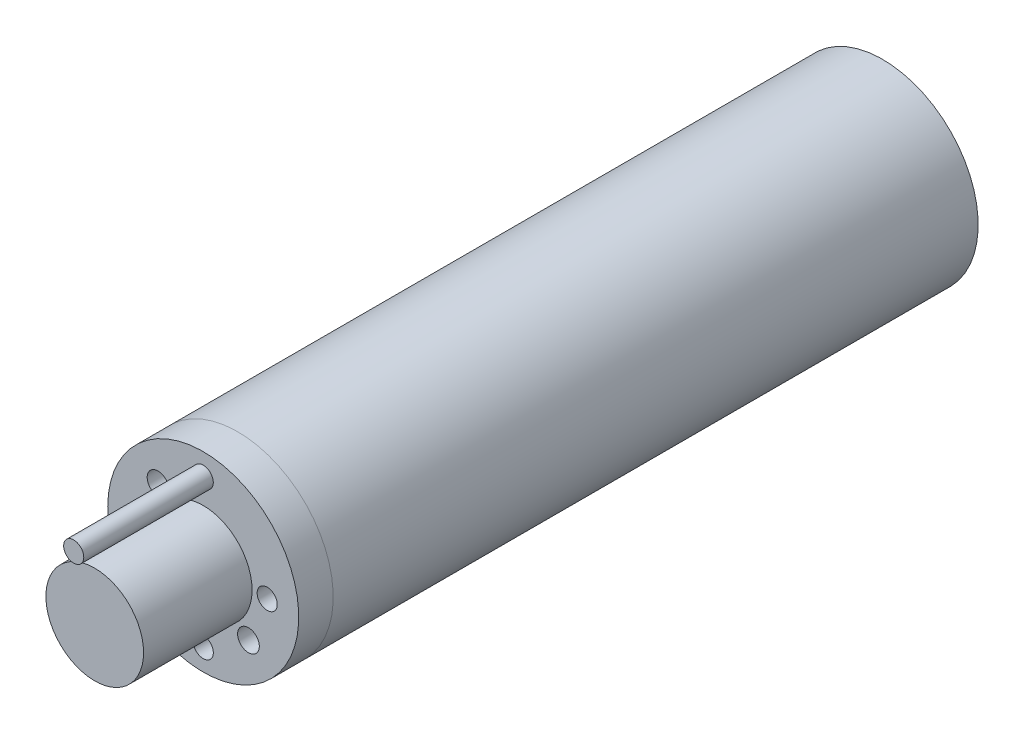
ISO-10303-21;
HEADER;
FILE_DESCRIPTION(('STEP AP214'),'2;1');
FILE_NAME('part.step','',(''),(''),'','','');
FILE_SCHEMA(('AUTOMOTIVE_DESIGN { 1 0 10303 214 1 1 1 1 }'));
ENDSEC;
DATA;
#1=APPLICATION_CONTEXT('core data for automotive mechanical design processes');
#2=APPLICATION_PROTOCOL_DEFINITION('international standard','automotive_design',2000,#1);
#3=PRODUCT_CONTEXT('',#1,'mechanical');
#4=PRODUCT('Part','Part','',(#3));
#5=PRODUCT_RELATED_PRODUCT_CATEGORY('part','',(#4));
#6=PRODUCT_DEFINITION_FORMATION('','',#4);
#7=PRODUCT_DEFINITION_CONTEXT('part definition',#1,'design');
#8=PRODUCT_DEFINITION('design','',#6,#7);
#9=PRODUCT_DEFINITION_SHAPE('','',#8);
#10=(LENGTH_UNIT() NAMED_UNIT(*) SI_UNIT(.MILLI.,.METRE.));
#11=(NAMED_UNIT(*) PLANE_ANGLE_UNIT() SI_UNIT($,.RADIAN.));
#12=(NAMED_UNIT(*) SI_UNIT($,.STERADIAN.) SOLID_ANGLE_UNIT());
#13=UNCERTAINTY_MEASURE_WITH_UNIT(LENGTH_MEASURE(1.E-05),#10,'distance_accuracy_value','');
#14=(GEOMETRIC_REPRESENTATION_CONTEXT(3) GLOBAL_UNCERTAINTY_ASSIGNED_CONTEXT((#13)) GLOBAL_UNIT_ASSIGNED_CONTEXT((#10,
#11,#12)) REPRESENTATION_CONTEXT('',''));
#15=CARTESIAN_POINT('',(0.,0.,0.));
#16=DIRECTION('',(0.,0.,1.));
#17=DIRECTION('',(1.,0.,0.));
#18=AXIS2_PLACEMENT_3D('',#15,#16,#17);
#19=CARTESIAN_POINT('',(0.,0.,3.175));
#20=DIRECTION('',(0.,0.,1.));
#21=DIRECTION('',(-1.,0.,0.));
#22=AXIS2_PLACEMENT_3D('',#19,#20,#21);
#23=CYLINDRICAL_SURFACE('',#22,4.5);
#24=CARTESIAN_POINT('',(0.,0.,13.175));
#25=DIRECTION('',(0.,0.,1.));
#26=DIRECTION('',(-1.,0.,0.));
#27=AXIS2_PLACEMENT_3D('',#24,#25,#26);
#28=CIRCLE('',#27,4.5);
#29=CARTESIAN_POINT('',(4.5,0.,13.175));
#30=VERTEX_POINT('',#29);
#31=EDGE_CURVE('P0_E28',#30,#30,#28,.T.);
#32=ORIENTED_EDGE('',*,*,#31,.F.);
#33=DIRECTION('',(0.,0.,-1.));
#34=VECTOR('',#33,1.);
#35=CARTESIAN_POINT('',(4.5,0.,3.175));
#36=LINE('',#35,#34);
#37=CARTESIAN_POINT('',(4.5,0.,3.175));
#38=VERTEX_POINT('',#37);
#39=EDGE_CURVE('P0_E11',#30,#38,#36,.T.);
#40=ORIENTED_EDGE('',*,*,#39,.T.);
#41=CARTESIAN_POINT('',(0.,0.,3.175));
#42=DIRECTION('',(0.,0.,-1.));
#43=DIRECTION('',(-1.,0.,0.));
#44=AXIS2_PLACEMENT_3D('',#41,#42,#43);
#45=CIRCLE('',#44,4.5);
#46=EDGE_CURVE('P0_E112',#38,#38,#45,.T.);
#47=ORIENTED_EDGE('',*,*,#46,.F.);
#48=ORIENTED_EDGE('',*,*,#39,.F.);
#49=EDGE_LOOP('',(#32,#40,#47,#48));
#50=FACE_BOUND('',#49,.T.);
#51=ADVANCED_FACE('P0_F17',(#50),#23,.T.);
#52=CARTESIAN_POINT('',(0.,0.,13.175));
#53=DIRECTION('',(0.,0.,1.));
#54=DIRECTION('',(1.,0.,0.));
#55=AXIS2_PLACEMENT_3D('',#52,#53,#54);
#56=PLANE('',#55);
#57=ORIENTED_EDGE('',*,*,#31,.T.);
#58=EDGE_LOOP('',(#57));
#59=FACE_BOUND('',#58,.T.);
#60=ADVANCED_FACE('P0_F223',(#59),#56,.T.);
#61=CARTESIAN_POINT('',(4.16683884017609,-4.16683884017609,0.));
#62=DIRECTION('',(0.,0.,1.));
#63=DIRECTION('',(1.,0.,0.));
#64=AXIS2_PLACEMENT_3D('',#61,#62,#63);
#65=CYLINDRICAL_SURFACE('',#64,1.);
#66=CARTESIAN_POINT('',(4.16683884017609,-4.16683884017609,3.175));
#67=DIRECTION('',(0.,0.,-1.));
#68=DIRECTION('',(1.,0.,0.));
#69=AXIS2_PLACEMENT_3D('',#66,#67,#68);
#70=CIRCLE('',#69,1.);
#71=CARTESIAN_POINT('',(3.16683884017609,-4.16683884017609,3.175));
#72=VERTEX_POINT('',#71);
#73=EDGE_CURVE('P0_E193',#72,#72,#70,.T.);
#74=ORIENTED_EDGE('',*,*,#73,.F.);
#75=DIRECTION('',(0.,0.,-1.));
#76=VECTOR('',#75,1.);
#77=CARTESIAN_POINT('',(3.16683884017609,-4.16683884017609,0.));
#78=LINE('',#77,#76);
#79=CARTESIAN_POINT('',(3.16683884017609,-4.16683884017609,0.));
#80=VERTEX_POINT('',#79);
#81=EDGE_CURVE('P0_E156',#72,#80,#78,.T.);
#82=ORIENTED_EDGE('',*,*,#81,.T.);
#83=CARTESIAN_POINT('',(4.16683884017609,-4.16683884017609,0.));
#84=DIRECTION('',(0.,0.,-1.));
#85=DIRECTION('',(1.,0.,0.));
#86=AXIS2_PLACEMENT_3D('',#83,#84,#85);
#87=CIRCLE('',#86,1.);
#88=EDGE_CURVE('P0_E21',#80,#80,#87,.T.);
#89=ORIENTED_EDGE('',*,*,#88,.T.);
#90=ORIENTED_EDGE('',*,*,#81,.F.);
#91=EDGE_LOOP('',(#74,#82,#89,#90));
#92=FACE_BOUND('',#91,.T.);
#93=ADVANCED_FACE('P0_F19',(#92),#65,.F.);
#94=CARTESIAN_POINT('',(-4.16683884017609,4.16683884017609,0.));
#95=DIRECTION('',(0.,0.,1.));
#96=DIRECTION('',(1.,0.,0.));
#97=AXIS2_PLACEMENT_3D('',#94,#95,#96);
#98=CYLINDRICAL_SURFACE('',#97,1.);
#99=CARTESIAN_POINT('',(-4.16683884017609,4.16683884017609,3.175));
#100=DIRECTION('',(0.,0.,-1.));
#101=DIRECTION('',(1.,0.,0.));
#102=AXIS2_PLACEMENT_3D('',#99,#100,#101);
#103=CIRCLE('',#102,1.);
#104=CARTESIAN_POINT('',(-5.16683884017609,4.16683884017609,3.175));
#105=VERTEX_POINT('',#104);
#106=EDGE_CURVE('P0_E195',#105,#105,#103,.T.);
#107=ORIENTED_EDGE('',*,*,#106,.F.);
#108=DIRECTION('',(0.,0.,-1.));
#109=VECTOR('',#108,1.);
#110=CARTESIAN_POINT('',(-5.16683884017609,4.16683884017609,0.));
#111=LINE('',#110,#109);
#112=CARTESIAN_POINT('',(-5.16683884017609,4.16683884017609,0.));
#113=VERTEX_POINT('',#112);
#114=EDGE_CURVE('P0_E134',#105,#113,#111,.T.);
#115=ORIENTED_EDGE('',*,*,#114,.T.);
#116=CARTESIAN_POINT('',(-4.16683884017609,4.16683884017609,0.));
#117=DIRECTION('',(0.,0.,-1.));
#118=DIRECTION('',(1.,0.,0.));
#119=AXIS2_PLACEMENT_3D('',#116,#117,#118);
#120=CIRCLE('',#119,1.);
#121=EDGE_CURVE('P0_E65',#113,#113,#120,.T.);
#122=ORIENTED_EDGE('',*,*,#121,.T.);
#123=ORIENTED_EDGE('',*,*,#114,.F.);
#124=EDGE_LOOP('',(#107,#115,#122,#123));
#125=FACE_BOUND('',#124,.T.);
#126=ADVANCED_FACE('P0_F213',(#125),#98,.F.);
#127=CARTESIAN_POINT('',(5.8928,0.,0.));
#128=DIRECTION('',(0.,0.,1.));
#129=DIRECTION('',(1.,0.,0.));
#130=AXIS2_PLACEMENT_3D('',#127,#128,#129);
#131=CYLINDRICAL_SURFACE('',#130,0.927);
#132=CARTESIAN_POINT('',(5.8928,0.,3.175));
#133=DIRECTION('',(0.,0.,-1.));
#134=DIRECTION('',(1.,0.,0.));
#135=AXIS2_PLACEMENT_3D('',#132,#133,#134);
#136=CIRCLE('',#135,0.927);
#137=CARTESIAN_POINT('',(4.9658,0.,3.175));
#138=VERTEX_POINT('',#137);
#139=EDGE_CURVE('P0_E78',#138,#138,#136,.T.);
#140=ORIENTED_EDGE('',*,*,#139,.F.);
#141=DIRECTION('',(0.,0.,-1.));
#142=VECTOR('',#141,1.);
#143=CARTESIAN_POINT('',(4.9658,0.,0.));
#144=LINE('',#143,#142);
#145=CARTESIAN_POINT('',(4.9658,0.,0.));
#146=VERTEX_POINT('',#145);
#147=EDGE_CURVE('P0_E139',#138,#146,#144,.T.);
#148=ORIENTED_EDGE('',*,*,#147,.T.);
#149=CARTESIAN_POINT('',(5.8928,0.,0.));
#150=DIRECTION('',(0.,0.,-1.));
#151=DIRECTION('',(1.,0.,0.));
#152=AXIS2_PLACEMENT_3D('',#149,#150,#151);
#153=CIRCLE('',#152,0.927);
#154=EDGE_CURVE('P0_E88',#146,#146,#153,.T.);
#155=ORIENTED_EDGE('',*,*,#154,.T.);
#156=ORIENTED_EDGE('',*,*,#147,.F.);
#157=EDGE_LOOP('',(#140,#148,#155,#156));
#158=FACE_BOUND('',#157,.T.);
#159=ADVANCED_FACE('P0_F215',(#158),#131,.F.);
#160=CARTESIAN_POINT('',(-5.8928,0.,0.));
#161=DIRECTION('',(0.,0.,1.));
#162=DIRECTION('',(1.,0.,0.));
#163=AXIS2_PLACEMENT_3D('',#160,#161,#162);
#164=CYLINDRICAL_SURFACE('',#163,0.927);
#165=CARTESIAN_POINT('',(-5.8928,0.,3.175));
#166=DIRECTION('',(0.,0.,-1.));
#167=DIRECTION('',(1.,0.,0.));
#168=AXIS2_PLACEMENT_3D('',#165,#166,#167);
#169=CIRCLE('',#168,0.927);
#170=CARTESIAN_POINT('',(-6.8198,0.,3.175));
#171=VERTEX_POINT('',#170);
#172=EDGE_CURVE('P0_E155',#171,#171,#169,.T.);
#173=ORIENTED_EDGE('',*,*,#172,.F.);
#174=DIRECTION('',(0.,0.,-1.));
#175=VECTOR('',#174,1.);
#176=CARTESIAN_POINT('',(-6.8198,0.,0.));
#177=LINE('',#176,#175);
#178=CARTESIAN_POINT('',(-6.8198,0.,0.));
#179=VERTEX_POINT('',#178);
#180=EDGE_CURVE('P0_E151',#171,#179,#177,.T.);
#181=ORIENTED_EDGE('',*,*,#180,.T.);
#182=CARTESIAN_POINT('',(-5.8928,0.,0.));
#183=DIRECTION('',(0.,0.,-1.));
#184=DIRECTION('',(1.,0.,0.));
#185=AXIS2_PLACEMENT_3D('',#182,#183,#184);
#186=CIRCLE('',#185,0.927);
#187=EDGE_CURVE('P0_E147',#179,#179,#186,.T.);
#188=ORIENTED_EDGE('',*,*,#187,.T.);
#189=ORIENTED_EDGE('',*,*,#180,.F.);
#190=EDGE_LOOP('',(#173,#181,#188,#189));
#191=FACE_BOUND('',#190,.T.);
#192=ADVANCED_FACE('P0_F186',(#191),#164,.F.);
#193=CARTESIAN_POINT('',(0.,-6.7945,0.));
#194=DIRECTION('',(0.,0.,1.));
#195=DIRECTION('',(1.,0.,0.));
#196=AXIS2_PLACEMENT_3D('',#193,#194,#195);
#197=CYLINDRICAL_SURFACE('',#196,0.927);
#198=CARTESIAN_POINT('',(0.,-6.7945,3.175));
#199=DIRECTION('',(0.,0.,-1.));
#200=DIRECTION('',(1.,0.,0.));
#201=AXIS2_PLACEMENT_3D('',#198,#199,#200);
#202=CIRCLE('',#201,0.927);
#203=CARTESIAN_POINT('',(-0.927,-6.7945,3.175));
#204=VERTEX_POINT('',#203);
#205=EDGE_CURVE('P0_E143',#204,#204,#202,.T.);
#206=ORIENTED_EDGE('',*,*,#205,.F.);
#207=DIRECTION('',(0.,0.,-1.));
#208=VECTOR('',#207,1.);
#209=CARTESIAN_POINT('',(-0.927,-6.7945,0.));
#210=LINE('',#209,#208);
#211=CARTESIAN_POINT('',(-0.927,-6.7945,0.));
#212=VERTEX_POINT('',#211);
#213=EDGE_CURVE('P0_E125',#204,#212,#210,.T.);
#214=ORIENTED_EDGE('',*,*,#213,.T.);
#215=CARTESIAN_POINT('',(0.,-6.7945,0.));
#216=DIRECTION('',(0.,0.,-1.));
#217=DIRECTION('',(1.,0.,0.));
#218=AXIS2_PLACEMENT_3D('',#215,#216,#217);
#219=CIRCLE('',#218,0.927);
#220=EDGE_CURVE('P0_E132',#212,#212,#219,.T.);
#221=ORIENTED_EDGE('',*,*,#220,.T.);
#222=ORIENTED_EDGE('',*,*,#213,.F.);
#223=EDGE_LOOP('',(#206,#214,#221,#222));
#224=FACE_BOUND('',#223,.T.);
#225=ADVANCED_FACE('P0_F170',(#224),#197,.F.);
#226=CARTESIAN_POINT('',(0.,6.7945,0.));
#227=DIRECTION('',(0.,0.,1.));
#228=DIRECTION('',(1.,0.,0.));
#229=AXIS2_PLACEMENT_3D('',#226,#227,#228);
#230=CYLINDRICAL_SURFACE('',#229,0.927);
#231=CARTESIAN_POINT('',(0.,6.7945,3.175));
#232=DIRECTION('',(0.,0.,-1.));
#233=DIRECTION('',(1.,0.,0.));
#234=AXIS2_PLACEMENT_3D('',#231,#232,#233);
#235=CIRCLE('',#234,0.927);
#236=CARTESIAN_POINT('',(-0.927,6.7945,3.175));
#237=VERTEX_POINT('',#236);
#238=EDGE_CURVE('P0_E121',#237,#237,#235,.T.);
#239=ORIENTED_EDGE('',*,*,#238,.F.);
#240=DIRECTION('',(0.,0.,-1.));
#241=VECTOR('',#240,1.);
#242=CARTESIAN_POINT('',(-0.927,6.7945,0.));
#243=LINE('',#242,#241);
#244=CARTESIAN_POINT('',(-0.927,6.7945,0.));
#245=VERTEX_POINT('',#244);
#246=EDGE_CURVE('P0_E129',#237,#245,#243,.T.);
#247=ORIENTED_EDGE('',*,*,#246,.T.);
#248=CARTESIAN_POINT('',(0.,6.7945,0.));
#249=DIRECTION('',(0.,0.,-1.));
#250=DIRECTION('',(1.,0.,0.));
#251=AXIS2_PLACEMENT_3D('',#248,#249,#250);
#252=CIRCLE('',#251,0.927);
#253=EDGE_CURVE('P0_E127',#245,#245,#252,.T.);
#254=ORIENTED_EDGE('',*,*,#253,.T.);
#255=ORIENTED_EDGE('',*,*,#246,.F.);
#256=EDGE_LOOP('',(#239,#247,#254,#255));
#257=FACE_BOUND('',#256,.T.);
#258=ADVANCED_FACE('P0_F235',(#257),#230,.F.);
#259=CARTESIAN_POINT('',(0.,0.,0.));
#260=DIRECTION('',(0.,0.,1.));
#261=DIRECTION('',(1.,0.,0.));
#262=AXIS2_PLACEMENT_3D('',#259,#260,#261);
#263=CYLINDRICAL_SURFACE('',#262,8.8011);
#264=CARTESIAN_POINT('',(0.,0.,3.175));
#265=DIRECTION('',(0.,0.,1.));
#266=DIRECTION('',(1.,0.,0.));
#267=AXIS2_PLACEMENT_3D('',#264,#265,#266);
#268=CIRCLE('',#267,8.8011);
#269=CARTESIAN_POINT('',(-8.8011,0.,3.175));
#270=VERTEX_POINT('',#269);
#271=EDGE_CURVE('P0_E105',#270,#270,#268,.T.);
#272=ORIENTED_EDGE('',*,*,#271,.F.);
#273=DIRECTION('',(0.,0.,-1.));
#274=VECTOR('',#273,1.);
#275=CARTESIAN_POINT('',(-8.8011,0.,0.));
#276=LINE('',#275,#274);
#277=CARTESIAN_POINT('',(-8.8011,0.,0.));
#278=VERTEX_POINT('',#277);
#279=EDGE_CURVE('P0_E108',#270,#278,#276,.T.);
#280=ORIENTED_EDGE('',*,*,#279,.T.);
#281=CARTESIAN_POINT('',(0.,0.,0.));
#282=DIRECTION('',(0.,0.,1.));
#283=DIRECTION('',(1.,0.,0.));
#284=AXIS2_PLACEMENT_3D('',#281,#282,#283);
#285=CIRCLE('',#284,8.8011);
#286=EDGE_CURVE('P0_E111',#278,#278,#285,.T.);
#287=ORIENTED_EDGE('',*,*,#286,.T.);
#288=ORIENTED_EDGE('',*,*,#279,.F.);
#289=EDGE_LOOP('',(#272,#280,#287,#288));
#290=FACE_BOUND('',#289,.T.);
#291=ADVANCED_FACE('P0_F106',(#290),#263,.T.);
#292=CARTESIAN_POINT('',(0.,0.,3.175));
#293=DIRECTION('',(0.,0.,1.));
#294=DIRECTION('',(1.,0.,0.));
#295=AXIS2_PLACEMENT_3D('',#292,#293,#294);
#296=PLANE('',#295);
#297=ORIENTED_EDGE('',*,*,#271,.T.);
#298=EDGE_LOOP('',(#297));
#299=FACE_BOUND('',#298,.T.);
#300=ORIENTED_EDGE('',*,*,#46,.T.);
#301=EDGE_LOOP('',(#300));
#302=FACE_BOUND('',#301,.T.);
#303=ORIENTED_EDGE('',*,*,#238,.T.);
#304=EDGE_LOOP('',(#303));
#305=FACE_BOUND('',#304,.T.);
#306=ORIENTED_EDGE('',*,*,#205,.T.);
#307=EDGE_LOOP('',(#306));
#308=FACE_BOUND('',#307,.T.);
#309=ORIENTED_EDGE('',*,*,#172,.T.);
#310=EDGE_LOOP('',(#309));
#311=FACE_BOUND('',#310,.T.);
#312=ORIENTED_EDGE('',*,*,#139,.T.);
#313=EDGE_LOOP('',(#312));
#314=FACE_BOUND('',#313,.T.);
#315=ORIENTED_EDGE('',*,*,#106,.T.);
#316=EDGE_LOOP('',(#315));
#317=FACE_BOUND('',#316,.T.);
#318=ORIENTED_EDGE('',*,*,#73,.T.);
#319=EDGE_LOOP('',(#318));
#320=FACE_BOUND('',#319,.T.);
#321=ADVANCED_FACE('P0_F210',(#299,#302,#305,#308,#311,#314,#317,#320),#296,.T.);
#322=CARTESIAN_POINT('',(0.,0.,0.));
#323=DIRECTION('',(0.,0.,1.));
#324=DIRECTION('',(1.,0.,0.));
#325=AXIS2_PLACEMENT_3D('',#322,#323,#324);
#326=PLANE('',#325);
#327=ORIENTED_EDGE('',*,*,#286,.F.);
#328=EDGE_LOOP('',(#327));
#329=FACE_BOUND('',#328,.T.);
#330=ORIENTED_EDGE('',*,*,#253,.F.);
#331=EDGE_LOOP('',(#330));
#332=FACE_BOUND('',#331,.T.);
#333=ORIENTED_EDGE('',*,*,#220,.F.);
#334=EDGE_LOOP('',(#333));
#335=FACE_BOUND('',#334,.T.);
#336=ORIENTED_EDGE('',*,*,#187,.F.);
#337=EDGE_LOOP('',(#336));
#338=FACE_BOUND('',#337,.T.);
#339=ORIENTED_EDGE('',*,*,#154,.F.);
#340=EDGE_LOOP('',(#339));
#341=FACE_BOUND('',#340,.T.);
#342=ORIENTED_EDGE('',*,*,#121,.F.);
#343=EDGE_LOOP('',(#342));
#344=FACE_BOUND('',#343,.T.);
#345=ORIENTED_EDGE('',*,*,#88,.F.);
#346=EDGE_LOOP('',(#345));
#347=FACE_BOUND('',#346,.T.);
#348=ADVANCED_FACE('P0_F183',(#329,#332,#335,#338,#341,#344,#347),#326,.F.);
#349=CLOSED_SHELL('',(#51,#60,#93,#126,#159,#192,#225,#258,#291,#321,#348));
#350=MANIFOLD_SOLID_BREP('P0_B1',#349);
#351=CARTESIAN_POINT('',(0.,6.7945,3.175));
#352=DIRECTION('',(0.,0.,1.));
#353=DIRECTION('',(-1.,0.,0.));
#354=AXIS2_PLACEMENT_3D('',#351,#352,#353);
#355=CYLINDRICAL_SURFACE('',#354,0.927);
#356=CARTESIAN_POINT('',(0.,6.7945,15.113));
#357=DIRECTION('',(0.,0.,1.));
#358=DIRECTION('',(-1.,0.,0.));
#359=AXIS2_PLACEMENT_3D('',#356,#357,#358);
#360=CIRCLE('',#359,0.927);
#361=CARTESIAN_POINT('',(0.927,6.7945,15.113));
#362=VERTEX_POINT('',#361);
#363=EDGE_CURVE('P1_E37',#362,#362,#360,.T.);
#364=ORIENTED_EDGE('',*,*,#363,.F.);
#365=DIRECTION('',(0.,0.,-1.));
#366=VECTOR('',#365,1.);
#367=CARTESIAN_POINT('',(0.927,6.7945,3.175));
#368=LINE('',#367,#366);
#369=CARTESIAN_POINT('',(0.927,6.7945,3.175));
#370=VERTEX_POINT('',#369);
#371=EDGE_CURVE('P1_E11',#362,#370,#368,.T.);
#372=ORIENTED_EDGE('',*,*,#371,.T.);
#373=CARTESIAN_POINT('',(0.,6.7945,3.175));
#374=DIRECTION('',(0.,0.,1.));
#375=DIRECTION('',(-1.,0.,0.));
#376=AXIS2_PLACEMENT_3D('',#373,#374,#375);
#377=CIRCLE('',#376,0.927);
#378=EDGE_CURVE('P1_E21',#370,#370,#377,.T.);
#379=ORIENTED_EDGE('',*,*,#378,.T.);
#380=ORIENTED_EDGE('',*,*,#371,.F.);
#381=EDGE_LOOP('',(#364,#372,#379,#380));
#382=FACE_BOUND('',#381,.T.);
#383=ADVANCED_FACE('P1_F17',(#382),#355,.T.);
#384=CARTESIAN_POINT('',(0.,6.7945,15.113));
#385=DIRECTION('',(0.,0.,1.));
#386=DIRECTION('',(1.,0.,0.));
#387=AXIS2_PLACEMENT_3D('',#384,#385,#386);
#388=PLANE('',#387);
#389=ORIENTED_EDGE('',*,*,#363,.T.);
#390=EDGE_LOOP('',(#389));
#391=FACE_BOUND('',#390,.T.);
#392=ADVANCED_FACE('P1_F45',(#391),#388,.T.);
#393=CARTESIAN_POINT('',(0.,6.7945,3.175));
#394=DIRECTION('',(0.,0.,1.));
#395=DIRECTION('',(1.,0.,0.));
#396=AXIS2_PLACEMENT_3D('',#393,#394,#395);
#397=PLANE('',#396);
#398=ORIENTED_EDGE('',*,*,#378,.F.);
#399=EDGE_LOOP('',(#398));
#400=FACE_BOUND('',#399,.T.);
#401=ADVANCED_FACE('P1_F19',(#400),#397,.F.);
#402=CLOSED_SHELL('',(#383,#392,#401));
#403=MANIFOLD_SOLID_BREP('P1_B1',#402);
#404=CARTESIAN_POINT('',(0.,0.,0.));
#405=DIRECTION('',(0.,0.,-1.));
#406=DIRECTION('',(1.,0.,0.));
#407=AXIS2_PLACEMENT_3D('',#404,#405,#406);
#408=CYLINDRICAL_SURFACE('',#407,8.8011);
#409=CARTESIAN_POINT('',(0.,0.,-59.436));
#410=DIRECTION('',(0.,0.,-1.));
#411=DIRECTION('',(1.,0.,0.));
#412=AXIS2_PLACEMENT_3D('',#409,#410,#411);
#413=CIRCLE('',#412,8.8011);
#414=CARTESIAN_POINT('',(-8.8011,0.,-59.436));
#415=VERTEX_POINT('',#414);
#416=EDGE_CURVE('P2_E20',#415,#415,#413,.T.);
#417=ORIENTED_EDGE('',*,*,#416,.F.);
#418=DIRECTION('',(0.,0.,1.));
#419=VECTOR('',#418,1.);
#420=CARTESIAN_POINT('',(-8.8011,0.,0.));
#421=LINE('',#420,#419);
#422=CARTESIAN_POINT('',(-8.8011,0.,0.));
#423=VERTEX_POINT('',#422);
#424=EDGE_CURVE('P2_E10',#415,#423,#421,.T.);
#425=ORIENTED_EDGE('',*,*,#424,.T.);
#426=CARTESIAN_POINT('',(0.,0.,0.));
#427=DIRECTION('',(0.,0.,-1.));
#428=DIRECTION('',(1.,0.,0.));
#429=AXIS2_PLACEMENT_3D('',#426,#427,#428);
#430=CIRCLE('',#429,8.8011);
#431=EDGE_CURVE('P2_E26',#423,#423,#430,.T.);
#432=ORIENTED_EDGE('',*,*,#431,.T.);
#433=ORIENTED_EDGE('',*,*,#424,.F.);
#434=EDGE_LOOP('',(#417,#425,#432,#433));
#435=FACE_BOUND('',#434,.T.);
#436=ADVANCED_FACE('P2_F16',(#435),#408,.T.);
#437=CARTESIAN_POINT('',(0.,0.,-59.436));
#438=DIRECTION('',(0.,0.,-1.));
#439=DIRECTION('',(0.,-1.,0.));
#440=AXIS2_PLACEMENT_3D('',#437,#438,#439);
#441=PLANE('',#440);
#442=ORIENTED_EDGE('',*,*,#416,.T.);
#443=EDGE_LOOP('',(#442));
#444=FACE_BOUND('',#443,.T.);
#445=ADVANCED_FACE('P2_F45',(#444),#441,.T.);
#446=CARTESIAN_POINT('',(0.,0.,0.));
#447=DIRECTION('',(0.,0.,-1.));
#448=DIRECTION('',(0.,-1.,0.));
#449=AXIS2_PLACEMENT_3D('',#446,#447,#448);
#450=PLANE('',#449);
#451=ORIENTED_EDGE('',*,*,#431,.F.);
#452=EDGE_LOOP('',(#451));
#453=FACE_BOUND('',#452,.T.);
#454=ADVANCED_FACE('P2_F18',(#453),#450,.F.);
#455=CLOSED_SHELL('',(#436,#445,#454));
#456=MANIFOLD_SOLID_BREP('P2_B1',#455);
#457=ADVANCED_BREP_SHAPE_REPRESENTATION('',(#18,#350,#403,#456),#14);
#458=SHAPE_DEFINITION_REPRESENTATION(#9,#457);
ENDSEC;
END-ISO-10303-21;
